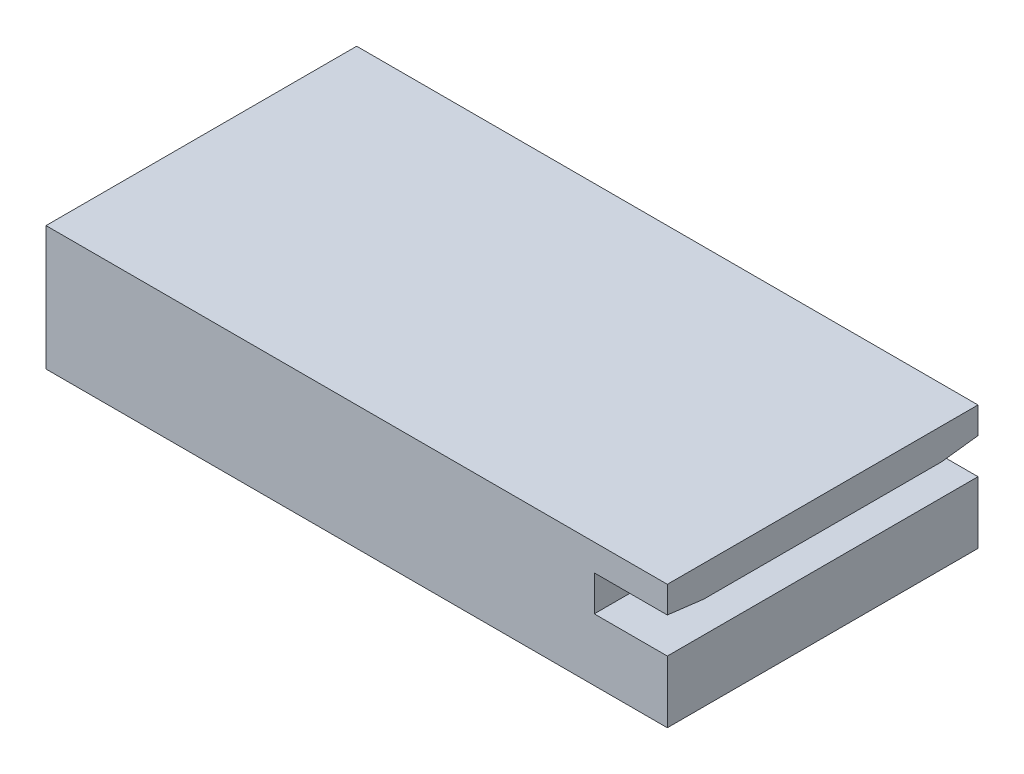
ISO-10303-21;
HEADER;
FILE_DESCRIPTION(('STEP AP214'),'2;1');
FILE_NAME('part.step','',(''),(''),'','','');
FILE_SCHEMA(('AUTOMOTIVE_DESIGN { 1 0 10303 214 1 1 1 1 }'));
ENDSEC;
DATA;
#1=APPLICATION_CONTEXT('core data for automotive mechanical design processes');
#2=APPLICATION_PROTOCOL_DEFINITION('international standard','automotive_design',2000,#1);
#3=PRODUCT_CONTEXT('',#1,'mechanical');
#4=PRODUCT('Part','Part','',(#3));
#5=PRODUCT_RELATED_PRODUCT_CATEGORY('part','',(#4));
#6=PRODUCT_DEFINITION_FORMATION('','',#4);
#7=PRODUCT_DEFINITION_CONTEXT('part definition',#1,'design');
#8=PRODUCT_DEFINITION('design','',#6,#7);
#9=PRODUCT_DEFINITION_SHAPE('','',#8);
#10=(LENGTH_UNIT() NAMED_UNIT(*) SI_UNIT(.MILLI.,.METRE.));
#11=(NAMED_UNIT(*) PLANE_ANGLE_UNIT() SI_UNIT($,.RADIAN.));
#12=(NAMED_UNIT(*) SI_UNIT($,.STERADIAN.) SOLID_ANGLE_UNIT());
#13=UNCERTAINTY_MEASURE_WITH_UNIT(LENGTH_MEASURE(1.E-05),#10,'distance_accuracy_value','');
#14=(GEOMETRIC_REPRESENTATION_CONTEXT(3) GLOBAL_UNCERTAINTY_ASSIGNED_CONTEXT((#13)) GLOBAL_UNIT_ASSIGNED_CONTEXT((#10,
#11,#12)) REPRESENTATION_CONTEXT('',''));
#15=CARTESIAN_POINT('',(0.,0.,0.));
#16=DIRECTION('',(0.,0.,1.));
#17=DIRECTION('',(1.,0.,0.));
#18=AXIS2_PLACEMENT_3D('',#15,#16,#17);
#19=CARTESIAN_POINT('',(960.,400.,-500.));
#20=DIRECTION('',(-1.,0.,0.));
#21=DIRECTION('',(0.,0.,1.));
#22=AXIS2_PLACEMENT_3D('',#19,#20,#21);
#23=PLANE('',#22);
#24=DIRECTION('',(0.,-1.,0.));
#25=VECTOR('',#24,1.);
#26=CARTESIAN_POINT('',(960.,400.,460.));
#27=LINE('',#26,#25);
#28=CARTESIAN_POINT('',(960.,180.,460.));
#29=VERTEX_POINT('',#28);
#30=CARTESIAN_POINT('',(960.,40.,460.));
#31=VERTEX_POINT('',#30);
#32=EDGE_CURVE('E340',#29,#31,#27,.T.);
#33=ORIENTED_EDGE('',*,*,#32,.F.);
#34=DIRECTION('',(0.,0.,-1.));
#35=VECTOR('',#34,1.);
#36=CARTESIAN_POINT('',(960.,180.,733.675691442478));
#37=LINE('',#36,#35);
#38=CARTESIAN_POINT('',(960.,180.,-460.));
#39=VERTEX_POINT('',#38);
#40=EDGE_CURVE('E355',#29,#39,#37,.T.);
#41=ORIENTED_EDGE('',*,*,#40,.T.);
#42=DIRECTION('',(0.,-1.,0.));
#43=VECTOR('',#42,1.);
#44=CARTESIAN_POINT('',(960.,400.,-460.));
#45=LINE('',#44,#43);
#46=CARTESIAN_POINT('',(960.,40.,-460.));
#47=VERTEX_POINT('',#46);
#48=EDGE_CURVE('E336',#39,#47,#45,.T.);
#49=ORIENTED_EDGE('',*,*,#48,.T.);
#50=DIRECTION('',(0.,0.,-1.));
#51=VECTOR('',#50,1.);
#52=CARTESIAN_POINT('',(960.,40.,-500.));
#53=LINE('',#52,#51);
#54=EDGE_CURVE('E39',#31,#47,#53,.T.);
#55=ORIENTED_EDGE('',*,*,#54,.F.);
#56=EDGE_LOOP('',(#33,#41,#49,#55));
#57=FACE_BOUND('',#56,.T.);
#58=ADVANCED_FACE('F35',(#57),#23,.T.);
#59=CARTESIAN_POINT('',(960.,360.,-460.));
#60=VERTEX_POINT('',#59);
#61=CARTESIAN_POINT('',(960.,320.,-460.));
#62=VERTEX_POINT('',#61);
#63=EDGE_CURVE('E333',#60,#62,#45,.T.);
#64=ORIENTED_EDGE('',*,*,#63,.T.);
#65=DIRECTION('',(0.,0.,-1.));
#66=VECTOR('',#65,1.);
#67=CARTESIAN_POINT('',(960.,320.,733.675691442478));
#68=LINE('',#67,#66);
#69=CARTESIAN_POINT('',(960.,320.,460.));
#70=VERTEX_POINT('',#69);
#71=EDGE_CURVE('E478',#70,#62,#68,.T.);
#72=ORIENTED_EDGE('',*,*,#71,.F.);
#73=CARTESIAN_POINT('',(960.,360.,460.));
#74=VERTEX_POINT('',#73);
#75=EDGE_CURVE('E338',#74,#70,#27,.T.);
#76=ORIENTED_EDGE('',*,*,#75,.F.);
#77=DIRECTION('',(0.,0.,-1.));
#78=VECTOR('',#77,1.);
#79=CARTESIAN_POINT('',(960.,360.,-500.));
#80=LINE('',#79,#78);
#81=EDGE_CURVE('E319',#74,#60,#80,.T.);
#82=ORIENTED_EDGE('',*,*,#81,.T.);
#83=EDGE_LOOP('',(#64,#72,#76,#82));
#84=FACE_BOUND('',#83,.T.);
#85=ADVANCED_FACE('F378',(#84),#23,.T.);
#86=CARTESIAN_POINT('',(-1000.,400.,-460.));
#87=DIRECTION('',(0.,0.,1.));
#88=DIRECTION('',(1.,0.,0.));
#89=AXIS2_PLACEMENT_3D('',#86,#87,#88);
#90=PLANE('',#89);
#91=ORIENTED_EDGE('',*,*,#48,.F.);
#92=DIRECTION('',(1.,0.,0.));
#93=VECTOR('',#92,1.);
#94=CARTESIAN_POINT('',(724.84391548055,180.,-460.));
#95=LINE('',#94,#93);
#96=CARTESIAN_POINT('',(724.84391548055,180.,-460.));
#97=VERTEX_POINT('',#96);
#98=EDGE_CURVE('E487',#97,#39,#95,.T.);
#99=ORIENTED_EDGE('',*,*,#98,.F.);
#100=DIRECTION('',(0.,-1.,0.));
#101=VECTOR('',#100,1.);
#102=CARTESIAN_POINT('',(724.84391548055,320.,-460.));
#103=LINE('',#102,#101);
#104=CARTESIAN_POINT('',(724.84391548055,320.,-460.));
#105=VERTEX_POINT('',#104);
#106=EDGE_CURVE('E484',#105,#97,#103,.T.);
#107=ORIENTED_EDGE('',*,*,#106,.F.);
#108=DIRECTION('',(-1.,0.,0.));
#109=VECTOR('',#108,1.);
#110=CARTESIAN_POINT('',(960.,320.,-460.));
#111=LINE('',#110,#109);
#112=EDGE_CURVE('E481',#62,#105,#111,.T.);
#113=ORIENTED_EDGE('',*,*,#112,.F.);
#114=ORIENTED_EDGE('',*,*,#63,.F.);
#115=DIRECTION('',(-1.,0.,0.));
#116=VECTOR('',#115,1.);
#117=CARTESIAN_POINT('',(-1000.,360.,-460.));
#118=LINE('',#117,#116);
#119=CARTESIAN_POINT('',(-960.,360.,-460.));
#120=VERTEX_POINT('',#119);
#121=EDGE_CURVE('E317',#60,#120,#118,.T.);
#122=ORIENTED_EDGE('',*,*,#121,.T.);
#123=DIRECTION('',(0.,-1.,0.));
#124=VECTOR('',#123,1.);
#125=CARTESIAN_POINT('',(-960.,400.,-460.));
#126=LINE('',#125,#124);
#127=CARTESIAN_POINT('',(-960.,40.,-460.));
#128=VERTEX_POINT('',#127);
#129=EDGE_CURVE('E328',#120,#128,#126,.T.);
#130=ORIENTED_EDGE('',*,*,#129,.T.);
#131=DIRECTION('',(-1.,0.,0.));
#132=VECTOR('',#131,1.);
#133=CARTESIAN_POINT('',(-1000.,40.,-460.));
#134=LINE('',#133,#132);
#135=EDGE_CURVE('E337',#47,#128,#134,.T.);
#136=ORIENTED_EDGE('',*,*,#135,.F.);
#137=EDGE_LOOP('',(#91,#99,#107,#113,#114,#122,#130,#136));
#138=FACE_BOUND('',#137,.T.);
#139=ADVANCED_FACE('F358',(#138),#90,.T.);
#140=CARTESIAN_POINT('',(-1000.,400.,460.));
#141=DIRECTION('',(0.,0.,-1.));
#142=DIRECTION('',(-1.,0.,0.));
#143=AXIS2_PLACEMENT_3D('',#140,#141,#142);
#144=PLANE('',#143);
#145=DIRECTION('',(0.,1.,0.));
#146=VECTOR('',#145,1.);
#147=CARTESIAN_POINT('',(724.84391548055,320.,460.));
#148=LINE('',#147,#146);
#149=CARTESIAN_POINT('',(724.84391548055,180.,460.));
#150=VERTEX_POINT('',#149);
#151=CARTESIAN_POINT('',(724.84391548055,320.,460.));
#152=VERTEX_POINT('',#151);
#153=EDGE_CURVE('E60',#150,#152,#148,.T.);
#154=ORIENTED_EDGE('',*,*,#153,.F.);
#155=DIRECTION('',(-1.,0.,0.));
#156=VECTOR('',#155,1.);
#157=CARTESIAN_POINT('',(724.84391548055,180.,460.));
#158=LINE('',#157,#156);
#159=EDGE_CURVE('E475',#29,#150,#158,.T.);
#160=ORIENTED_EDGE('',*,*,#159,.F.);
#161=ORIENTED_EDGE('',*,*,#32,.T.);
#162=DIRECTION('',(1.,0.,0.));
#163=VECTOR('',#162,1.);
#164=CARTESIAN_POINT('',(-1000.,40.,460.));
#165=LINE('',#164,#163);
#166=CARTESIAN_POINT('',(-960.,40.,460.));
#167=VERTEX_POINT('',#166);
#168=EDGE_CURVE('E325',#167,#31,#165,.T.);
#169=ORIENTED_EDGE('',*,*,#168,.F.);
#170=DIRECTION('',(0.,-1.,0.));
#171=VECTOR('',#170,1.);
#172=CARTESIAN_POINT('',(-960.,400.,460.));
#173=LINE('',#172,#171);
#174=CARTESIAN_POINT('',(-960.,360.,460.));
#175=VERTEX_POINT('',#174);
#176=EDGE_CURVE('E322',#175,#167,#173,.T.);
#177=ORIENTED_EDGE('',*,*,#176,.F.);
#178=DIRECTION('',(1.,0.,0.));
#179=VECTOR('',#178,1.);
#180=CARTESIAN_POINT('',(-1000.,360.,460.));
#181=LINE('',#180,#179);
#182=EDGE_CURVE('E11',#175,#74,#181,.T.);
#183=ORIENTED_EDGE('',*,*,#182,.T.);
#184=ORIENTED_EDGE('',*,*,#75,.T.);
#185=DIRECTION('',(1.,0.,0.));
#186=VECTOR('',#185,1.);
#187=CARTESIAN_POINT('',(960.,320.,460.));
#188=LINE('',#187,#186);
#189=EDGE_CURVE('E225',#152,#70,#188,.T.);
#190=ORIENTED_EDGE('',*,*,#189,.F.);
#191=EDGE_LOOP('',(#154,#160,#161,#169,#177,#183,#184,#190));
#192=FACE_BOUND('',#191,.T.);
#193=ADVANCED_FACE('F367',(#192),#144,.T.);
#194=CARTESIAN_POINT('',(1000.,400.,-500.));
#195=DIRECTION('',(-1.,0.,0.));
#196=DIRECTION('',(0.,0.,1.));
#197=AXIS2_PLACEMENT_3D('',#194,#195,#196);
#198=PLANE('',#197);
#199=DIRECTION('',(0.,0.,-1.));
#200=VECTOR('',#199,1.);
#201=CARTESIAN_POINT('',(1000.,200.,500.));
#202=LINE('',#201,#200);
#203=CARTESIAN_POINT('',(1000.,200.,500.));
#204=VERTEX_POINT('',#203);
#205=CARTESIAN_POINT('',(1000.,200.,-500.));
#206=VERTEX_POINT('',#205);
#207=EDGE_CURVE('E217',#204,#206,#202,.T.);
#208=ORIENTED_EDGE('',*,*,#207,.F.);
#209=DIRECTION('',(0.,-1.,0.));
#210=VECTOR('',#209,1.);
#211=CARTESIAN_POINT('',(1000.,400.,500.));
#212=LINE('',#211,#210);
#213=CARTESIAN_POINT('',(1000.,0.,500.));
#214=VERTEX_POINT('',#213);
#215=EDGE_CURVE('E296',#204,#214,#212,.T.);
#216=ORIENTED_EDGE('',*,*,#215,.T.);
#217=DIRECTION('',(0.,0.,-1.));
#218=VECTOR('',#217,1.);
#219=CARTESIAN_POINT('',(1000.,0.,-500.));
#220=LINE('',#219,#218);
#221=CARTESIAN_POINT('',(1000.,0.,-500.));
#222=VERTEX_POINT('',#221);
#223=EDGE_CURVE('E285',#214,#222,#220,.T.);
#224=ORIENTED_EDGE('',*,*,#223,.T.);
#225=DIRECTION('',(0.,-1.,0.));
#226=VECTOR('',#225,1.);
#227=CARTESIAN_POINT('',(1000.,400.,-500.));
#228=LINE('',#227,#226);
#229=EDGE_CURVE('E312',#206,#222,#228,.T.);
#230=ORIENTED_EDGE('',*,*,#229,.F.);
#231=EDGE_LOOP('',(#208,#216,#224,#230));
#232=FACE_BOUND('',#231,.T.);
#233=ADVANCED_FACE('F369',(#232),#198,.F.);
#234=CARTESIAN_POINT('',(0.,40.,0.));
#235=DIRECTION('',(0.,1.,0.));
#236=DIRECTION('',(0.,0.,1.));
#237=AXIS2_PLACEMENT_3D('',#234,#235,#236);
#238=PLANE('',#237);
#239=CARTESIAN_POINT('',(-780.,40.,280.));
#240=DIRECTION('',(0.,1.,0.));
#241=DIRECTION('',(0.,0.,1.));
#242=AXIS2_PLACEMENT_3D('',#239,#240,#241);
#243=CIRCLE('',#242,20.0000000000001);
#244=CARTESIAN_POINT('',(-780.,40.,300.));
#245=VERTEX_POINT('',#244);
#246=EDGE_CURVE('E236',#245,#245,#243,.F.);
#247=ORIENTED_EDGE('',*,*,#246,.T.);
#248=EDGE_LOOP('',(#247));
#249=FACE_BOUND('',#248,.T.);
#250=CARTESIAN_POINT('',(854.59,40.,280.));
#251=DIRECTION('',(0.,1.,0.));
#252=DIRECTION('',(0.,0.,1.));
#253=AXIS2_PLACEMENT_3D('',#250,#251,#252);
#254=CIRCLE('',#253,20.);
#255=CARTESIAN_POINT('',(854.59,40.,300.));
#256=VERTEX_POINT('',#255);
#257=EDGE_CURVE('E237',#256,#256,#254,.F.);
#258=ORIENTED_EDGE('',*,*,#257,.T.);
#259=EDGE_LOOP('',(#258));
#260=FACE_BOUND('',#259,.T.);
#261=CARTESIAN_POINT('',(780.,40.,-280.));
#262=DIRECTION('',(0.,1.,0.));
#263=DIRECTION('',(0.,0.,1.));
#264=AXIS2_PLACEMENT_3D('',#261,#262,#263);
#265=CIRCLE('',#264,20.0000000000001);
#266=CARTESIAN_POINT('',(780.,40.,-260.));
#267=VERTEX_POINT('',#266);
#268=EDGE_CURVE('E244',#267,#267,#265,.F.);
#269=ORIENTED_EDGE('',*,*,#268,.T.);
#270=EDGE_LOOP('',(#269));
#271=FACE_BOUND('',#270,.T.);
#272=CARTESIAN_POINT('',(-705.41,40.,-280.));
#273=DIRECTION('',(0.,1.,0.));
#274=DIRECTION('',(0.,0.,1.));
#275=AXIS2_PLACEMENT_3D('',#272,#273,#274);
#276=CIRCLE('',#275,20.);
#277=CARTESIAN_POINT('',(-705.41,40.,-260.));
#278=VERTEX_POINT('',#277);
#279=EDGE_CURVE('E250',#278,#278,#276,.F.);
#280=ORIENTED_EDGE('',*,*,#279,.T.);
#281=EDGE_LOOP('',(#280));
#282=FACE_BOUND('',#281,.T.);
#283=ORIENTED_EDGE('',*,*,#54,.T.);
#284=ORIENTED_EDGE('',*,*,#135,.T.);
#285=DIRECTION('',(0.,0.,1.));
#286=VECTOR('',#285,1.);
#287=CARTESIAN_POINT('',(-960.,40.,-500.));
#288=LINE('',#287,#286);
#289=EDGE_CURVE('E331',#128,#167,#288,.T.);
#290=ORIENTED_EDGE('',*,*,#289,.T.);
#291=ORIENTED_EDGE('',*,*,#168,.T.);
#292=EDGE_LOOP('',(#283,#284,#290,#291));
#293=FACE_BOUND('',#292,.T.);
#294=DIRECTION('',(-1.,0.,0.));
#295=VECTOR('',#294,1.);
#296=CARTESIAN_POINT('',(-160.,40.,-272.5));
#297=LINE('',#296,#295);
#298=CARTESIAN_POINT('',(160.,40.,-272.5));
#299=VERTEX_POINT('',#298);
#300=CARTESIAN_POINT('',(-160.,40.,-272.5));
#301=VERTEX_POINT('',#300);
#302=EDGE_CURVE('E270',#299,#301,#297,.T.);
#303=ORIENTED_EDGE('',*,*,#302,.F.);
#304=DIRECTION('',(0.,0.,-1.));
#305=VECTOR('',#304,1.);
#306=CARTESIAN_POINT('',(160.,40.,-272.5));
#307=LINE('',#306,#305);
#308=CARTESIAN_POINT('',(160.,40.,272.5));
#309=VERTEX_POINT('',#308);
#310=EDGE_CURVE('E240',#309,#299,#307,.T.);
#311=ORIENTED_EDGE('',*,*,#310,.F.);
#312=DIRECTION('',(1.,0.,0.));
#313=VECTOR('',#312,1.);
#314=CARTESIAN_POINT('',(-160.,40.,272.5));
#315=LINE('',#314,#313);
#316=CARTESIAN_POINT('',(-160.,40.,272.5));
#317=VERTEX_POINT('',#316);
#318=EDGE_CURVE('E261',#317,#309,#315,.T.);
#319=ORIENTED_EDGE('',*,*,#318,.F.);
#320=DIRECTION('',(0.,0.,1.));
#321=VECTOR('',#320,1.);
#322=CARTESIAN_POINT('',(-160.,40.,-272.5));
#323=LINE('',#322,#321);
#324=EDGE_CURVE('E272',#301,#317,#323,.T.);
#325=ORIENTED_EDGE('',*,*,#324,.F.);
#326=EDGE_LOOP('',(#303,#311,#319,#325));
#327=FACE_BOUND('',#326,.T.);
#328=ADVANCED_FACE('F37',(#249,#260,#271,#282,#293,#327),#238,.T.);
#329=CARTESIAN_POINT('',(-960.,400.,-500.));
#330=DIRECTION('',(1.,0.,0.));
#331=DIRECTION('',(0.,0.,-1.));
#332=AXIS2_PLACEMENT_3D('',#329,#330,#331);
#333=PLANE('',#332);
#334=ORIENTED_EDGE('',*,*,#289,.F.);
#335=ORIENTED_EDGE('',*,*,#129,.F.);
#336=DIRECTION('',(0.,0.,1.));
#337=VECTOR('',#336,1.);
#338=CARTESIAN_POINT('',(-960.,360.,-500.));
#339=LINE('',#338,#337);
#340=EDGE_CURVE('E44',#120,#175,#339,.T.);
#341=ORIENTED_EDGE('',*,*,#340,.T.);
#342=ORIENTED_EDGE('',*,*,#176,.T.);
#343=EDGE_LOOP('',(#334,#335,#341,#342));
#344=FACE_BOUND('',#343,.T.);
#345=ADVANCED_FACE('F364',(#344),#333,.T.);
#346=CARTESIAN_POINT('',(0.,360.,0.));
#347=DIRECTION('',(0.,1.,0.));
#348=DIRECTION('',(0.,0.,1.));
#349=AXIS2_PLACEMENT_3D('',#346,#347,#348);
#350=PLANE('',#349);
#351=ORIENTED_EDGE('',*,*,#81,.F.);
#352=ORIENTED_EDGE('',*,*,#182,.F.);
#353=ORIENTED_EDGE('',*,*,#340,.F.);
#354=ORIENTED_EDGE('',*,*,#121,.F.);
#355=EDGE_LOOP('',(#351,#352,#353,#354));
#356=FACE_BOUND('',#355,.T.);
#357=ADVANCED_FACE('F389',(#356),#350,.F.);
#358=CARTESIAN_POINT('',(160.,325.,-272.5));
#359=DIRECTION('',(-1.,0.,0.));
#360=DIRECTION('',(0.,0.,1.));
#361=AXIS2_PLACEMENT_3D('',#358,#359,#360);
#362=PLANE('',#361);
#363=ORIENTED_EDGE('',*,*,#310,.T.);
#364=DIRECTION('',(0.,-1.,0.));
#365=VECTOR('',#364,1.);
#366=CARTESIAN_POINT('',(160.,325.,-272.5));
#367=LINE('',#366,#365);
#368=CARTESIAN_POINT('',(160.,325.,-272.5));
#369=VERTEX_POINT('',#368);
#370=EDGE_CURVE('E283',#369,#299,#367,.T.);
#371=ORIENTED_EDGE('',*,*,#370,.F.);
#372=DIRECTION('',(0.,0.,-1.));
#373=VECTOR('',#372,1.);
#374=CARTESIAN_POINT('',(160.,325.,-272.5));
#375=LINE('',#374,#373);
#376=CARTESIAN_POINT('',(160.,325.,272.5));
#377=VERTEX_POINT('',#376);
#378=EDGE_CURVE('E257',#377,#369,#375,.T.);
#379=ORIENTED_EDGE('',*,*,#378,.F.);
#380=DIRECTION('',(0.,-1.,0.));
#381=VECTOR('',#380,1.);
#382=CARTESIAN_POINT('',(160.,325.,272.5));
#383=LINE('',#382,#381);
#384=EDGE_CURVE('E267',#377,#309,#383,.T.);
#385=ORIENTED_EDGE('',*,*,#384,.T.);
#386=EDGE_LOOP('',(#363,#371,#379,#385));
#387=FACE_BOUND('',#386,.T.);
#388=ADVANCED_FACE('F394',(#387),#362,.F.);
#389=CARTESIAN_POINT('',(-160.,325.,-272.5));
#390=DIRECTION('',(0.,0.,1.));
#391=DIRECTION('',(1.,0.,0.));
#392=AXIS2_PLACEMENT_3D('',#389,#390,#391);
#393=PLANE('',#392);
#394=ORIENTED_EDGE('',*,*,#302,.T.);
#395=DIRECTION('',(0.,-1.,0.));
#396=VECTOR('',#395,1.);
#397=CARTESIAN_POINT('',(-160.,325.,-272.5));
#398=LINE('',#397,#396);
#399=CARTESIAN_POINT('',(-160.,325.,-272.5));
#400=VERTEX_POINT('',#399);
#401=EDGE_CURVE('E280',#400,#301,#398,.T.);
#402=ORIENTED_EDGE('',*,*,#401,.F.);
#403=DIRECTION('',(-1.,0.,0.));
#404=VECTOR('',#403,1.);
#405=CARTESIAN_POINT('',(-160.,325.,-272.5));
#406=LINE('',#405,#404);
#407=EDGE_CURVE('E260',#369,#400,#406,.T.);
#408=ORIENTED_EDGE('',*,*,#407,.F.);
#409=ORIENTED_EDGE('',*,*,#370,.T.);
#410=EDGE_LOOP('',(#394,#402,#408,#409));
#411=FACE_BOUND('',#410,.T.);
#412=ADVANCED_FACE('F433',(#411),#393,.F.);
#413=CARTESIAN_POINT('',(-160.,325.,-272.5));
#414=DIRECTION('',(1.,0.,0.));
#415=DIRECTION('',(0.,0.,-1.));
#416=AXIS2_PLACEMENT_3D('',#413,#414,#415);
#417=PLANE('',#416);
#418=ORIENTED_EDGE('',*,*,#324,.T.);
#419=DIRECTION('',(0.,-1.,0.));
#420=VECTOR('',#419,1.);
#421=CARTESIAN_POINT('',(-160.,325.,272.5));
#422=LINE('',#421,#420);
#423=CARTESIAN_POINT('',(-160.,325.,272.5));
#424=VERTEX_POINT('',#423);
#425=EDGE_CURVE('E278',#424,#317,#422,.T.);
#426=ORIENTED_EDGE('',*,*,#425,.F.);
#427=DIRECTION('',(0.,0.,1.));
#428=VECTOR('',#427,1.);
#429=CARTESIAN_POINT('',(-160.,325.,-272.5));
#430=LINE('',#429,#428);
#431=EDGE_CURVE('E263',#400,#424,#430,.T.);
#432=ORIENTED_EDGE('',*,*,#431,.F.);
#433=ORIENTED_EDGE('',*,*,#401,.T.);
#434=EDGE_LOOP('',(#418,#426,#432,#433));
#435=FACE_BOUND('',#434,.T.);
#436=ADVANCED_FACE('F429',(#435),#417,.F.);
#437=CARTESIAN_POINT('',(-160.,325.,272.5));
#438=DIRECTION('',(0.,0.,-1.));
#439=DIRECTION('',(-1.,0.,0.));
#440=AXIS2_PLACEMENT_3D('',#437,#438,#439);
#441=PLANE('',#440);
#442=ORIENTED_EDGE('',*,*,#318,.T.);
#443=ORIENTED_EDGE('',*,*,#384,.F.);
#444=DIRECTION('',(1.,0.,0.));
#445=VECTOR('',#444,1.);
#446=CARTESIAN_POINT('',(-160.,325.,272.5));
#447=LINE('',#446,#445);
#448=EDGE_CURVE('E265',#424,#377,#447,.T.);
#449=ORIENTED_EDGE('',*,*,#448,.F.);
#450=ORIENTED_EDGE('',*,*,#425,.T.);
#451=EDGE_LOOP('',(#442,#443,#449,#450));
#452=FACE_BOUND('',#451,.T.);
#453=ADVANCED_FACE('F422',(#452),#441,.F.);
#454=CARTESIAN_POINT('',(0.,325.,0.));
#455=DIRECTION('',(0.,1.,0.));
#456=DIRECTION('',(0.,0.,1.));
#457=AXIS2_PLACEMENT_3D('',#454,#455,#456);
#458=PLANE('',#457);
#459=ORIENTED_EDGE('',*,*,#378,.T.);
#460=ORIENTED_EDGE('',*,*,#407,.T.);
#461=ORIENTED_EDGE('',*,*,#431,.T.);
#462=ORIENTED_EDGE('',*,*,#448,.T.);
#463=EDGE_LOOP('',(#459,#460,#461,#462));
#464=FACE_BOUND('',#463,.T.);
#465=ADVANCED_FACE('F413',(#464),#458,.T.);
#466=CARTESIAN_POINT('',(-705.41,96.5685424949241,-280.));
#467=DIRECTION('',(0.,-1.,0.));
#468=DIRECTION('',(0.,0.,-1.));
#469=AXIS2_PLACEMENT_3D('',#466,#467,#468);
#470=CYLINDRICAL_SURFACE('',#469,20.);
#471=CARTESIAN_POINT('',(-705.41,0.,-280.));
#472=DIRECTION('',(0.,-1.,0.));
#473=DIRECTION('',(0.,0.,-1.));
#474=AXIS2_PLACEMENT_3D('',#471,#472,#473);
#475=CIRCLE('',#474,20.);
#476=CARTESIAN_POINT('',(-705.41,0.,-300.));
#477=VERTEX_POINT('',#476);
#478=EDGE_CURVE('E232',#477,#477,#475,.T.);
#479=ORIENTED_EDGE('',*,*,#478,.T.);
#480=EDGE_LOOP('',(#479));
#481=FACE_BOUND('',#480,.T.);
#482=ORIENTED_EDGE('',*,*,#279,.F.);
#483=EDGE_LOOP('',(#482));
#484=FACE_BOUND('',#483,.T.);
#485=ADVANCED_FACE('F410',(#481,#484),#470,.F.);
#486=CARTESIAN_POINT('',(780.,96.5685424949241,-280.));
#487=DIRECTION('',(0.,-1.,0.));
#488=DIRECTION('',(0.,0.,-1.));
#489=AXIS2_PLACEMENT_3D('',#486,#487,#488);
#490=CYLINDRICAL_SURFACE('',#489,20.0000000000001);
#491=CARTESIAN_POINT('',(780.,0.,-280.));
#492=DIRECTION('',(0.,-1.,0.));
#493=DIRECTION('',(0.,0.,-1.));
#494=AXIS2_PLACEMENT_3D('',#491,#492,#493);
#495=CIRCLE('',#494,20.0000000000001);
#496=CARTESIAN_POINT('',(780.,0.,-300.));
#497=VERTEX_POINT('',#496);
#498=EDGE_CURVE('E247',#497,#497,#495,.T.);
#499=ORIENTED_EDGE('',*,*,#498,.T.);
#500=EDGE_LOOP('',(#499));
#501=FACE_BOUND('',#500,.T.);
#502=ORIENTED_EDGE('',*,*,#268,.F.);
#503=EDGE_LOOP('',(#502));
#504=FACE_BOUND('',#503,.T.);
#505=ADVANCED_FACE('F412',(#501,#504),#490,.F.);
#506=CARTESIAN_POINT('',(854.59,96.5685424949241,280.));
#507=DIRECTION('',(0.,-1.,0.));
#508=DIRECTION('',(0.,0.,-1.));
#509=AXIS2_PLACEMENT_3D('',#506,#507,#508);
#510=CYLINDRICAL_SURFACE('',#509,20.);
#511=CARTESIAN_POINT('',(854.59,0.,280.));
#512=DIRECTION('',(0.,-1.,0.));
#513=DIRECTION('',(0.,0.,-1.));
#514=AXIS2_PLACEMENT_3D('',#511,#512,#513);
#515=CIRCLE('',#514,20.);
#516=CARTESIAN_POINT('',(854.59,0.,260.));
#517=VERTEX_POINT('',#516);
#518=EDGE_CURVE('E241',#517,#517,#515,.T.);
#519=ORIENTED_EDGE('',*,*,#518,.T.);
#520=EDGE_LOOP('',(#519));
#521=FACE_BOUND('',#520,.T.);
#522=ORIENTED_EDGE('',*,*,#257,.F.);
#523=EDGE_LOOP('',(#522));
#524=FACE_BOUND('',#523,.T.);
#525=ADVANCED_FACE('F419',(#521,#524),#510,.F.);
#526=CARTESIAN_POINT('',(-780.,96.5685424949241,280.));
#527=DIRECTION('',(0.,-1.,0.));
#528=DIRECTION('',(0.,0.,-1.));
#529=AXIS2_PLACEMENT_3D('',#526,#527,#528);
#530=CYLINDRICAL_SURFACE('',#529,20.0000000000001);
#531=CARTESIAN_POINT('',(-780.,0.,280.));
#532=DIRECTION('',(0.,-1.,0.));
#533=DIRECTION('',(0.,0.,-1.));
#534=AXIS2_PLACEMENT_3D('',#531,#532,#533);
#535=CIRCLE('',#534,20.0000000000001);
#536=CARTESIAN_POINT('',(-780.,0.,260.));
#537=VERTEX_POINT('',#536);
#538=EDGE_CURVE('E233',#537,#537,#535,.T.);
#539=ORIENTED_EDGE('',*,*,#538,.T.);
#540=EDGE_LOOP('',(#539));
#541=FACE_BOUND('',#540,.T.);
#542=ORIENTED_EDGE('',*,*,#246,.F.);
#543=EDGE_LOOP('',(#542));
#544=FACE_BOUND('',#543,.T.);
#545=ADVANCED_FACE('F463',(#541,#544),#530,.F.);
#546=CARTESIAN_POINT('',(1000.,400.,500.));
#547=VERTEX_POINT('',#546);
#548=CARTESIAN_POINT('',(1000.,314.392280451454,500.));
#549=VERTEX_POINT('',#548);
#550=EDGE_CURVE('E207',#547,#549,#212,.T.);
#551=ORIENTED_EDGE('',*,*,#550,.T.);
#552=DIRECTION('',(0.,0.121869343405152,0.992546151641322));
#553=VECTOR('',#552,1.);
#554=CARTESIAN_POINT('',(1000.,314.392280451454,500.));
#555=LINE('',#554,#553);
#556=CARTESIAN_POINT('',(1000.,300.,382.784282114796));
#557=VERTEX_POINT('',#556);
#558=EDGE_CURVE('E189',#557,#549,#555,.T.);
#559=ORIENTED_EDGE('',*,*,#558,.F.);
#560=DIRECTION('',(0.,0.,-1.));
#561=VECTOR('',#560,1.);
#562=CARTESIAN_POINT('',(1000.,300.,500.));
#563=LINE('',#562,#561);
#564=CARTESIAN_POINT('',(1000.,300.,-382.784282114796));
#565=VERTEX_POINT('',#564);
#566=EDGE_CURVE('E204',#557,#565,#563,.T.);
#567=ORIENTED_EDGE('',*,*,#566,.T.);
#568=DIRECTION('',(0.,-0.121869343405152,0.992546151641322));
#569=VECTOR('',#568,1.);
#570=CARTESIAN_POINT('',(1000.,314.392280451454,-500.000000000001));
#571=LINE('',#570,#569);
#572=CARTESIAN_POINT('',(1000.,314.392280451454,-500.000000000001));
#573=VERTEX_POINT('',#572);
#574=EDGE_CURVE('E468',#573,#565,#571,.T.);
#575=ORIENTED_EDGE('',*,*,#574,.F.);
#576=CARTESIAN_POINT('',(1000.,400.,-500.));
#577=VERTEX_POINT('',#576);
#578=EDGE_CURVE('E313',#577,#573,#228,.T.);
#579=ORIENTED_EDGE('',*,*,#578,.F.);
#580=DIRECTION('',(0.,0.,-1.));
#581=VECTOR('',#580,1.);
#582=CARTESIAN_POINT('',(1000.,400.,-500.));
#583=LINE('',#582,#581);
#584=EDGE_CURVE('E286',#547,#577,#583,.T.);
#585=ORIENTED_EDGE('',*,*,#584,.F.);
#586=EDGE_LOOP('',(#551,#559,#567,#575,#579,#585));
#587=FACE_BOUND('',#586,.T.);
#588=ADVANCED_FACE('F202',(#587),#198,.F.);
#589=CARTESIAN_POINT('',(-1000.,400.,-500.));
#590=DIRECTION('',(0.,0.,1.));
#591=DIRECTION('',(1.,0.,0.));
#592=AXIS2_PLACEMENT_3D('',#589,#590,#591);
#593=PLANE('',#592);
#594=ORIENTED_EDGE('',*,*,#578,.T.);
#595=DIRECTION('',(1.,0.,0.));
#596=VECTOR('',#595,1.);
#597=CARTESIAN_POINT('',(646.747928012994,314.392280451454,-500.));
#598=LINE('',#597,#596);
#599=CARTESIAN_POINT('',(764.84391548055,314.392280451454,-500.));
#600=VERTEX_POINT('',#599);
#601=EDGE_CURVE('E466',#600,#573,#598,.T.);
#602=ORIENTED_EDGE('',*,*,#601,.F.);
#603=DIRECTION('',(0.,-1.,0.));
#604=VECTOR('',#603,1.);
#605=CARTESIAN_POINT('',(764.84391548055,300.,-500.));
#606=LINE('',#605,#604);
#607=CARTESIAN_POINT('',(764.84391548055,200.,-500.));
#608=VERTEX_POINT('',#607);
#609=EDGE_CURVE('E215',#600,#608,#606,.T.);
#610=ORIENTED_EDGE('',*,*,#609,.T.);
#611=DIRECTION('',(-1.,0.,0.));
#612=VECTOR('',#611,1.);
#613=CARTESIAN_POINT('',(1000.,200.,-500.));
#614=LINE('',#613,#612);
#615=EDGE_CURVE('E221',#206,#608,#614,.T.);
#616=ORIENTED_EDGE('',*,*,#615,.F.);
#617=ORIENTED_EDGE('',*,*,#229,.T.);
#618=DIRECTION('',(-1.,0.,0.));
#619=VECTOR('',#618,1.);
#620=CARTESIAN_POINT('',(-1000.,0.,-500.));
#621=LINE('',#620,#619);
#622=CARTESIAN_POINT('',(-1000.,0.,-500.));
#623=VERTEX_POINT('',#622);
#624=EDGE_CURVE('E299',#222,#623,#621,.T.);
#625=ORIENTED_EDGE('',*,*,#624,.T.);
#626=DIRECTION('',(0.,-1.,0.));
#627=VECTOR('',#626,1.);
#628=CARTESIAN_POINT('',(-1000.,400.,-500.));
#629=LINE('',#628,#627);
#630=CARTESIAN_POINT('',(-1000.,400.,-500.));
#631=VERTEX_POINT('',#630);
#632=EDGE_CURVE('E309',#631,#623,#629,.T.);
#633=ORIENTED_EDGE('',*,*,#632,.F.);
#634=DIRECTION('',(-1.,0.,0.));
#635=VECTOR('',#634,1.);
#636=CARTESIAN_POINT('',(-1000.,400.,-500.));
#637=LINE('',#636,#635);
#638=EDGE_CURVE('E289',#577,#631,#637,.T.);
#639=ORIENTED_EDGE('',*,*,#638,.F.);
#640=EDGE_LOOP('',(#594,#602,#610,#616,#617,#625,#633,#639));
#641=FACE_BOUND('',#640,.T.);
#642=ADVANCED_FACE('F456',(#641),#593,.F.);
#643=CARTESIAN_POINT('',(-1000.,400.,-500.));
#644=DIRECTION('',(1.,0.,0.));
#645=DIRECTION('',(0.,0.,-1.));
#646=AXIS2_PLACEMENT_3D('',#643,#644,#645);
#647=PLANE('',#646);
#648=DIRECTION('',(0.,0.,1.));
#649=VECTOR('',#648,1.);
#650=CARTESIAN_POINT('',(-1000.,0.,-500.));
#651=LINE('',#650,#649);
#652=CARTESIAN_POINT('',(-1000.,0.,500.));
#653=VERTEX_POINT('',#652);
#654=EDGE_CURVE('E301',#623,#653,#651,.T.);
#655=ORIENTED_EDGE('',*,*,#654,.T.);
#656=DIRECTION('',(0.,-1.,0.));
#657=VECTOR('',#656,1.);
#658=CARTESIAN_POINT('',(-1000.,400.,500.));
#659=LINE('',#658,#657);
#660=CARTESIAN_POINT('',(-1000.,400.,500.));
#661=VERTEX_POINT('',#660);
#662=EDGE_CURVE('E306',#661,#653,#659,.T.);
#663=ORIENTED_EDGE('',*,*,#662,.F.);
#664=DIRECTION('',(0.,0.,1.));
#665=VECTOR('',#664,1.);
#666=CARTESIAN_POINT('',(-1000.,400.,-500.));
#667=LINE('',#666,#665);
#668=EDGE_CURVE('E292',#631,#661,#667,.T.);
#669=ORIENTED_EDGE('',*,*,#668,.F.);
#670=ORIENTED_EDGE('',*,*,#632,.T.);
#671=EDGE_LOOP('',(#655,#663,#669,#670));
#672=FACE_BOUND('',#671,.T.);
#673=ADVANCED_FACE('F453',(#672),#647,.F.);
#674=CARTESIAN_POINT('',(-1000.,400.,500.));
#675=DIRECTION('',(0.,0.,-1.));
#676=DIRECTION('',(-1.,0.,0.));
#677=AXIS2_PLACEMENT_3D('',#674,#675,#676);
#678=PLANE('',#677);
#679=DIRECTION('',(0.,-1.,0.));
#680=VECTOR('',#679,1.);
#681=CARTESIAN_POINT('',(764.84391548055,300.,500.));
#682=LINE('',#681,#680);
#683=CARTESIAN_POINT('',(764.84391548055,314.392280451454,500.));
#684=VERTEX_POINT('',#683);
#685=CARTESIAN_POINT('',(764.84391548055,200.,500.));
#686=VERTEX_POINT('',#685);
#687=EDGE_CURVE('E211',#684,#686,#682,.T.);
#688=ORIENTED_EDGE('',*,*,#687,.F.);
#689=DIRECTION('',(1.,0.,0.));
#690=VECTOR('',#689,1.);
#691=CARTESIAN_POINT('',(646.747928012995,314.392280451454,500.));
#692=LINE('',#691,#690);
#693=EDGE_CURVE('E197',#684,#549,#692,.T.);
#694=ORIENTED_EDGE('',*,*,#693,.T.);
#695=ORIENTED_EDGE('',*,*,#550,.F.);
#696=DIRECTION('',(1.,0.,0.));
#697=VECTOR('',#696,1.);
#698=CARTESIAN_POINT('',(-1000.,400.,500.));
#699=LINE('',#698,#697);
#700=EDGE_CURVE('E294',#661,#547,#699,.T.);
#701=ORIENTED_EDGE('',*,*,#700,.F.);
#702=ORIENTED_EDGE('',*,*,#662,.T.);
#703=DIRECTION('',(1.,0.,0.));
#704=VECTOR('',#703,1.);
#705=CARTESIAN_POINT('',(-1000.,0.,500.));
#706=LINE('',#705,#704);
#707=EDGE_CURVE('E290',#653,#214,#706,.T.);
#708=ORIENTED_EDGE('',*,*,#707,.T.);
#709=ORIENTED_EDGE('',*,*,#215,.F.);
#710=DIRECTION('',(1.,0.,0.));
#711=VECTOR('',#710,1.);
#712=CARTESIAN_POINT('',(1000.,200.,500.));
#713=LINE('',#712,#711);
#714=EDGE_CURVE('E227',#686,#204,#713,.T.);
#715=ORIENTED_EDGE('',*,*,#714,.F.);
#716=EDGE_LOOP('',(#688,#694,#695,#701,#702,#708,#709,#715));
#717=FACE_BOUND('',#716,.T.);
#718=ADVANCED_FACE('F445',(#717),#678,.F.);
#719=CARTESIAN_POINT('',(0.,400.,0.));
#720=DIRECTION('',(0.,1.,0.));
#721=DIRECTION('',(0.,0.,1.));
#722=AXIS2_PLACEMENT_3D('',#719,#720,#721);
#723=PLANE('',#722);
#724=ORIENTED_EDGE('',*,*,#584,.T.);
#725=ORIENTED_EDGE('',*,*,#638,.T.);
#726=ORIENTED_EDGE('',*,*,#668,.T.);
#727=ORIENTED_EDGE('',*,*,#700,.T.);
#728=EDGE_LOOP('',(#724,#725,#726,#727));
#729=FACE_BOUND('',#728,.T.);
#730=ADVANCED_FACE('F441',(#729),#723,.T.);
#731=CARTESIAN_POINT('',(0.,0.,0.));
#732=DIRECTION('',(0.,1.,0.));
#733=DIRECTION('',(0.,0.,1.));
#734=AXIS2_PLACEMENT_3D('',#731,#732,#733);
#735=PLANE('',#734);
#736=ORIENTED_EDGE('',*,*,#538,.F.);
#737=EDGE_LOOP('',(#736));
#738=FACE_BOUND('',#737,.T.);
#739=ORIENTED_EDGE('',*,*,#518,.F.);
#740=EDGE_LOOP('',(#739));
#741=FACE_BOUND('',#740,.T.);
#742=ORIENTED_EDGE('',*,*,#498,.F.);
#743=EDGE_LOOP('',(#742));
#744=FACE_BOUND('',#743,.T.);
#745=ORIENTED_EDGE('',*,*,#478,.F.);
#746=EDGE_LOOP('',(#745));
#747=FACE_BOUND('',#746,.T.);
#748=ORIENTED_EDGE('',*,*,#223,.F.);
#749=ORIENTED_EDGE('',*,*,#707,.F.);
#750=ORIENTED_EDGE('',*,*,#654,.F.);
#751=ORIENTED_EDGE('',*,*,#624,.F.);
#752=EDGE_LOOP('',(#748,#749,#750,#751));
#753=FACE_BOUND('',#752,.T.);
#754=ADVANCED_FACE('F444',(#738,#741,#744,#747,#753),#735,.F.);
#755=CARTESIAN_POINT('',(764.84391548055,300.,-500.));
#756=DIRECTION('',(1.,0.,0.));
#757=DIRECTION('',(0.,0.,-1.));
#758=AXIS2_PLACEMENT_3D('',#755,#756,#757);
#759=PLANE('',#758);
#760=DIRECTION('',(0.,0.,1.));
#761=VECTOR('',#760,1.);
#762=CARTESIAN_POINT('',(764.84391548055,200.,-500.));
#763=LINE('',#762,#761);
#764=EDGE_CURVE('E224',#608,#686,#763,.T.);
#765=ORIENTED_EDGE('',*,*,#764,.F.);
#766=ORIENTED_EDGE('',*,*,#609,.F.);
#767=DIRECTION('',(0.,0.121869343405152,-0.992546151641322));
#768=VECTOR('',#767,1.);
#769=CARTESIAN_POINT('',(764.84391548055,314.392280451454,-500.));
#770=LINE('',#769,#768);
#771=CARTESIAN_POINT('',(764.84391548055,300.,-382.784282114796));
#772=VERTEX_POINT('',#771);
#773=EDGE_CURVE('E208',#772,#600,#770,.T.);
#774=ORIENTED_EDGE('',*,*,#773,.F.);
#775=DIRECTION('',(0.,0.,1.));
#776=VECTOR('',#775,1.);
#777=CARTESIAN_POINT('',(764.84391548055,300.,-500.));
#778=LINE('',#777,#776);
#779=CARTESIAN_POINT('',(764.84391548055,300.,382.784282114796));
#780=VERTEX_POINT('',#779);
#781=EDGE_CURVE('E212',#772,#780,#778,.T.);
#782=ORIENTED_EDGE('',*,*,#781,.T.);
#783=DIRECTION('',(0.,-0.121869343405152,-0.992546151641322));
#784=VECTOR('',#783,1.);
#785=CARTESIAN_POINT('',(764.84391548055,314.392280451454,500.));
#786=LINE('',#785,#784);
#787=EDGE_CURVE('E192',#684,#780,#786,.T.);
#788=ORIENTED_EDGE('',*,*,#787,.F.);
#789=ORIENTED_EDGE('',*,*,#687,.T.);
#790=EDGE_LOOP('',(#765,#766,#774,#782,#788,#789));
#791=FACE_BOUND('',#790,.T.);
#792=ADVANCED_FACE('F449',(#791),#759,.T.);
#793=CARTESIAN_POINT('',(0.,300.,0.));
#794=DIRECTION('',(0.,1.,0.));
#795=DIRECTION('',(0.,0.,1.));
#796=AXIS2_PLACEMENT_3D('',#793,#794,#795);
#797=PLANE('',#796);
#798=ORIENTED_EDGE('',*,*,#566,.F.);
#799=DIRECTION('',(1.,0.,0.));
#800=VECTOR('',#799,1.);
#801=CARTESIAN_POINT('',(646.747928012994,300.,382.784282114796));
#802=LINE('',#801,#800);
#803=EDGE_CURVE('E185',#780,#557,#802,.T.);
#804=ORIENTED_EDGE('',*,*,#803,.F.);
#805=ORIENTED_EDGE('',*,*,#781,.F.);
#806=DIRECTION('',(1.,0.,0.));
#807=VECTOR('',#806,1.);
#808=CARTESIAN_POINT('',(646.747928012994,300.,-382.784282114796));
#809=LINE('',#808,#807);
#810=EDGE_CURVE('E52',#772,#565,#809,.T.);
#811=ORIENTED_EDGE('',*,*,#810,.T.);
#812=EDGE_LOOP('',(#798,#804,#805,#811));
#813=FACE_BOUND('',#812,.T.);
#814=ADVANCED_FACE('F210',(#813),#797,.F.);
#815=CARTESIAN_POINT('',(0.,200.,0.));
#816=DIRECTION('',(0.,1.,0.));
#817=DIRECTION('',(0.,0.,1.));
#818=AXIS2_PLACEMENT_3D('',#815,#816,#817);
#819=PLANE('',#818);
#820=ORIENTED_EDGE('',*,*,#764,.T.);
#821=ORIENTED_EDGE('',*,*,#714,.T.);
#822=ORIENTED_EDGE('',*,*,#207,.T.);
#823=ORIENTED_EDGE('',*,*,#615,.T.);
#824=EDGE_LOOP('',(#820,#821,#822,#823));
#825=FACE_BOUND('',#824,.T.);
#826=ADVANCED_FACE('F503',(#825),#819,.T.);
#827=CARTESIAN_POINT('',(724.84391548055,180.,733.675691442478));
#828=DIRECTION('',(0.,1.,0.));
#829=DIRECTION('',(0.,0.,1.));
#830=AXIS2_PLACEMENT_3D('',#827,#828,#829);
#831=PLANE('',#830);
#832=ORIENTED_EDGE('',*,*,#40,.F.);
#833=ORIENTED_EDGE('',*,*,#159,.T.);
#834=DIRECTION('',(0.,0.,-1.));
#835=VECTOR('',#834,1.);
#836=CARTESIAN_POINT('',(724.84391548055,180.,733.675691442478));
#837=LINE('',#836,#835);
#838=EDGE_CURVE('E490',#150,#97,#837,.T.);
#839=ORIENTED_EDGE('',*,*,#838,.T.);
#840=ORIENTED_EDGE('',*,*,#98,.T.);
#841=EDGE_LOOP('',(#832,#833,#839,#840));
#842=FACE_BOUND('',#841,.T.);
#843=ADVANCED_FACE('F501',(#842),#831,.F.);
#844=CARTESIAN_POINT('',(724.84391548055,320.,733.675691442478));
#845=DIRECTION('',(1.,0.,0.));
#846=DIRECTION('',(0.,0.,-1.));
#847=AXIS2_PLACEMENT_3D('',#844,#845,#846);
#848=PLANE('',#847);
#849=ORIENTED_EDGE('',*,*,#838,.F.);
#850=ORIENTED_EDGE('',*,*,#153,.T.);
#851=DIRECTION('',(0.,0.,-1.));
#852=VECTOR('',#851,1.);
#853=CARTESIAN_POINT('',(724.84391548055,320.,733.675691442478));
#854=LINE('',#853,#852);
#855=EDGE_CURVE('E492',#152,#105,#854,.T.);
#856=ORIENTED_EDGE('',*,*,#855,.T.);
#857=ORIENTED_EDGE('',*,*,#106,.T.);
#858=EDGE_LOOP('',(#849,#850,#856,#857));
#859=FACE_BOUND('',#858,.T.);
#860=ADVANCED_FACE('F499',(#859),#848,.F.);
#861=CARTESIAN_POINT('',(960.,320.,733.675691442478));
#862=DIRECTION('',(0.,-1.,0.));
#863=DIRECTION('',(1.,0.,0.));
#864=AXIS2_PLACEMENT_3D('',#861,#862,#863);
#865=PLANE('',#864);
#866=ORIENTED_EDGE('',*,*,#855,.F.);
#867=ORIENTED_EDGE('',*,*,#189,.T.);
#868=ORIENTED_EDGE('',*,*,#71,.T.);
#869=ORIENTED_EDGE('',*,*,#112,.T.);
#870=EDGE_LOOP('',(#866,#867,#868,#869));
#871=FACE_BOUND('',#870,.T.);
#872=ADVANCED_FACE('F496',(#871),#865,.F.);
#873=CARTESIAN_POINT('',(646.747928012994,314.392280451454,-500.));
#874=DIRECTION('',(0.,0.992546151641322,0.121869343405152));
#875=DIRECTION('',(0.,-0.121869343405152,0.992546151641322));
#876=AXIS2_PLACEMENT_3D('',#873,#874,#875);
#877=PLANE('',#876);
#878=ORIENTED_EDGE('',*,*,#773,.T.);
#879=ORIENTED_EDGE('',*,*,#601,.T.);
#880=ORIENTED_EDGE('',*,*,#574,.T.);
#881=ORIENTED_EDGE('',*,*,#810,.F.);
#882=EDGE_LOOP('',(#878,#879,#880,#881));
#883=FACE_BOUND('',#882,.T.);
#884=ADVANCED_FACE('F513',(#883),#877,.F.);
#885=CARTESIAN_POINT('',(646.747928012995,314.392280451454,500.));
#886=DIRECTION('',(0.,0.992546151641322,-0.121869343405152));
#887=DIRECTION('',(0.,0.121869343405152,0.992546151641322));
#888=AXIS2_PLACEMENT_3D('',#885,#886,#887);
#889=PLANE('',#888);
#890=ORIENTED_EDGE('',*,*,#787,.T.);
#891=ORIENTED_EDGE('',*,*,#803,.T.);
#892=ORIENTED_EDGE('',*,*,#558,.T.);
#893=ORIENTED_EDGE('',*,*,#693,.F.);
#894=EDGE_LOOP('',(#890,#891,#892,#893));
#895=FACE_BOUND('',#894,.T.);
#896=ADVANCED_FACE('F187',(#895),#889,.F.);
#897=CLOSED_SHELL('',(#58,#85,#139,#193,#233,#328,#345,#357,#388,#412,#436,#453,#465,#485,#505,
#525,#545,#588,#642,#673,#718,#730,#754,#792,#814,#826,#843,#860,#872,#884,#896));
#898=MANIFOLD_SOLID_BREP('B2',#897);
#899=ADVANCED_BREP_SHAPE_REPRESENTATION('',(#18,#898),#14);
#900=SHAPE_DEFINITION_REPRESENTATION(#9,#899);
ENDSEC;
END-ISO-10303-21;
